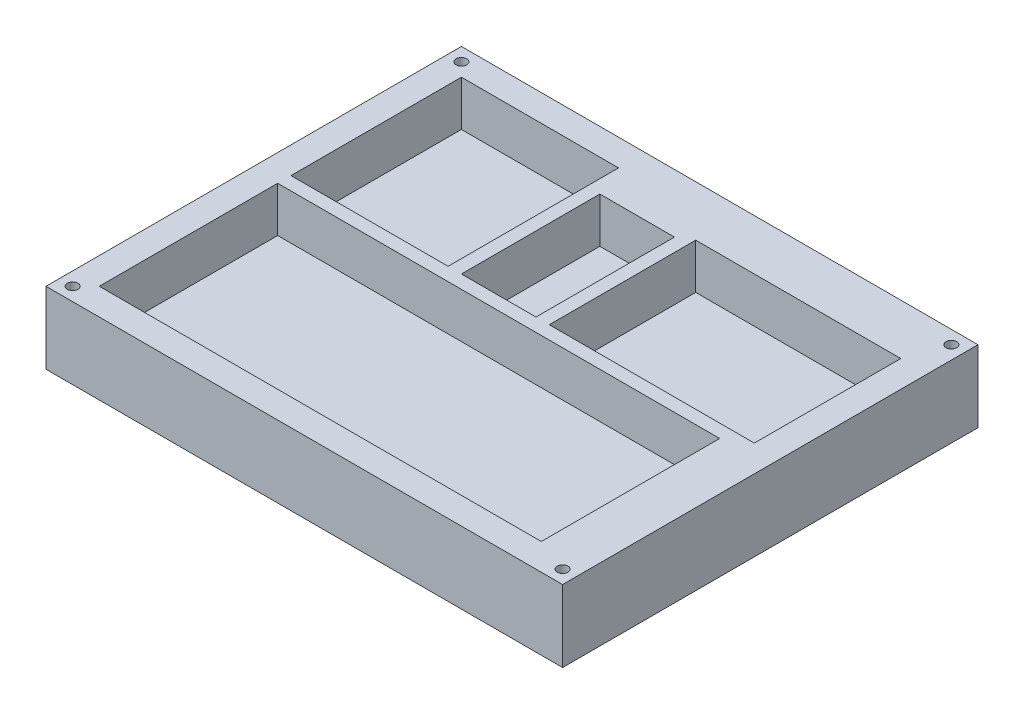
ISO-10303-21;
HEADER;
FILE_DESCRIPTION(('STEP AP214'),'2;1');
FILE_NAME('part.step','',(''),(''),'','','');
FILE_SCHEMA(('AUTOMOTIVE_DESIGN { 1 0 10303 214 1 1 1 1 }'));
ENDSEC;
DATA;
#1=APPLICATION_CONTEXT('core data for automotive mechanical design processes');
#2=APPLICATION_PROTOCOL_DEFINITION('international standard','automotive_design',2000,#1);
#3=PRODUCT_CONTEXT('',#1,'mechanical');
#4=PRODUCT('Part','Part','',(#3));
#5=PRODUCT_RELATED_PRODUCT_CATEGORY('part','',(#4));
#6=PRODUCT_DEFINITION_FORMATION('','',#4);
#7=PRODUCT_DEFINITION_CONTEXT('part definition',#1,'design');
#8=PRODUCT_DEFINITION('design','',#6,#7);
#9=PRODUCT_DEFINITION_SHAPE('','',#8);
#10=(LENGTH_UNIT() NAMED_UNIT(*) SI_UNIT(.MILLI.,.METRE.));
#11=(NAMED_UNIT(*) PLANE_ANGLE_UNIT() SI_UNIT($,.RADIAN.));
#12=(NAMED_UNIT(*) SI_UNIT($,.STERADIAN.) SOLID_ANGLE_UNIT());
#13=UNCERTAINTY_MEASURE_WITH_UNIT(LENGTH_MEASURE(1.E-05),#10,'distance_accuracy_value','');
#14=(GEOMETRIC_REPRESENTATION_CONTEXT(3) GLOBAL_UNCERTAINTY_ASSIGNED_CONTEXT((#13)) GLOBAL_UNIT_ASSIGNED_CONTEXT((#10,
#11,#12)) REPRESENTATION_CONTEXT('',''));
#15=CARTESIAN_POINT('',(0.,0.,0.));
#16=DIRECTION('',(0.,0.,1.));
#17=DIRECTION('',(1.,0.,0.));
#18=AXIS2_PLACEMENT_3D('',#15,#16,#17);
#19=CARTESIAN_POINT('',(0.,17.,-33.5));
#20=DIRECTION('',(0.,0.,-1.));
#21=DIRECTION('',(-1.,0.,0.));
#22=AXIS2_PLACEMENT_3D('',#19,#20,#21);
#23=PLANE('',#22);
#24=DIRECTION('',(1.,0.,0.));
#25=VECTOR('',#24,1.);
#26=CARTESIAN_POINT('',(0.,0.,-33.5));
#27=LINE('',#26,#25);
#28=CARTESIAN_POINT('',(-83.,0.,-33.5));
#29=VERTEX_POINT('',#28);
#30=CARTESIAN_POINT('',(83.,0.,-33.5));
#31=VERTEX_POINT('',#30);
#32=EDGE_CURVE('E227',#29,#31,#27,.T.);
#33=ORIENTED_EDGE('',*,*,#32,.T.);
#34=DIRECTION('',(0.,-1.,0.));
#35=VECTOR('',#34,1.);
#36=CARTESIAN_POINT('',(83.,17.,-33.5));
#37=LINE('',#36,#35);
#38=CARTESIAN_POINT('',(83.,17.,-33.5));
#39=VERTEX_POINT('',#38);
#40=EDGE_CURVE('E11',#39,#31,#37,.T.);
#41=ORIENTED_EDGE('',*,*,#40,.F.);
#42=DIRECTION('',(1.,0.,0.));
#43=VECTOR('',#42,1.);
#44=CARTESIAN_POINT('',(0.,17.,-33.5));
#45=LINE('',#44,#43);
#46=CARTESIAN_POINT('',(-83.,17.,-33.5));
#47=VERTEX_POINT('',#46);
#48=EDGE_CURVE('E173',#47,#39,#45,.T.);
#49=ORIENTED_EDGE('',*,*,#48,.F.);
#50=DIRECTION('',(0.,-1.,0.));
#51=VECTOR('',#50,1.);
#52=CARTESIAN_POINT('',(-83.,17.,-33.5));
#53=LINE('',#52,#51);
#54=EDGE_CURVE('E59',#47,#29,#53,.T.);
#55=ORIENTED_EDGE('',*,*,#54,.T.);
#56=EDGE_LOOP('',(#33,#41,#49,#55));
#57=FACE_BOUND('',#56,.T.);
#58=ADVANCED_FACE('F40',(#57),#23,.F.);
#59=CARTESIAN_POINT('',(83.,17.,0.));
#60=DIRECTION('',(1.,0.,0.));
#61=DIRECTION('',(0.,0.,-1.));
#62=AXIS2_PLACEMENT_3D('',#59,#60,#61);
#63=PLANE('',#62);
#64=DIRECTION('',(0.,0.,1.));
#65=VECTOR('',#64,1.);
#66=CARTESIAN_POINT('',(83.,0.,0.));
#67=LINE('',#66,#65);
#68=CARTESIAN_POINT('',(83.,0.,33.5));
#69=VERTEX_POINT('',#68);
#70=EDGE_CURVE('E179',#31,#69,#67,.T.);
#71=ORIENTED_EDGE('',*,*,#70,.T.);
#72=DIRECTION('',(0.,-1.,0.));
#73=VECTOR('',#72,1.);
#74=CARTESIAN_POINT('',(83.,17.,33.5));
#75=LINE('',#74,#73);
#76=CARTESIAN_POINT('',(83.,17.,33.5));
#77=VERTEX_POINT('',#76);
#78=EDGE_CURVE('E50',#77,#69,#75,.T.);
#79=ORIENTED_EDGE('',*,*,#78,.F.);
#80=DIRECTION('',(0.,0.,1.));
#81=VECTOR('',#80,1.);
#82=CARTESIAN_POINT('',(83.,17.,0.));
#83=LINE('',#82,#81);
#84=EDGE_CURVE('E167',#39,#77,#83,.T.);
#85=ORIENTED_EDGE('',*,*,#84,.F.);
#86=ORIENTED_EDGE('',*,*,#40,.T.);
#87=EDGE_LOOP('',(#71,#79,#85,#86));
#88=FACE_BOUND('',#87,.T.);
#89=ADVANCED_FACE('F178',(#88),#63,.F.);
#90=CARTESIAN_POINT('',(0.,17.,33.5));
#91=DIRECTION('',(0.,0.,-1.));
#92=DIRECTION('',(-1.,0.,0.));
#93=AXIS2_PLACEMENT_3D('',#90,#91,#92);
#94=PLANE('',#93);
#95=DIRECTION('',(1.,0.,0.));
#96=VECTOR('',#95,1.);
#97=CARTESIAN_POINT('',(0.,0.,33.5));
#98=LINE('',#97,#96);
#99=CARTESIAN_POINT('',(-83.,0.,33.5));
#100=VERTEX_POINT('',#99);
#101=EDGE_CURVE('E104',#100,#69,#98,.T.);
#102=ORIENTED_EDGE('',*,*,#101,.F.);
#103=DIRECTION('',(0.,-1.,0.));
#104=VECTOR('',#103,1.);
#105=CARTESIAN_POINT('',(-83.,17.,33.5));
#106=LINE('',#105,#104);
#107=CARTESIAN_POINT('',(-83.,17.,33.5));
#108=VERTEX_POINT('',#107);
#109=EDGE_CURVE('E181',#108,#100,#106,.T.);
#110=ORIENTED_EDGE('',*,*,#109,.F.);
#111=DIRECTION('',(1.,0.,0.));
#112=VECTOR('',#111,1.);
#113=CARTESIAN_POINT('',(0.,17.,33.5));
#114=LINE('',#113,#112);
#115=EDGE_CURVE('E172',#108,#77,#114,.T.);
#116=ORIENTED_EDGE('',*,*,#115,.T.);
#117=ORIENTED_EDGE('',*,*,#78,.T.);
#118=EDGE_LOOP('',(#102,#110,#116,#117));
#119=FACE_BOUND('',#118,.T.);
#120=ADVANCED_FACE('F183',(#119),#94,.T.);
#121=CARTESIAN_POINT('',(-24.,17.,0.));
#122=DIRECTION('',(-1.,0.,0.));
#123=DIRECTION('',(0.,0.,1.));
#124=AXIS2_PLACEMENT_3D('',#121,#122,#123);
#125=PLANE('',#124);
#126=DIRECTION('',(0.,0.,-1.));
#127=VECTOR('',#126,1.);
#128=CARTESIAN_POINT('',(-24.,0.,0.));
#129=LINE('',#128,#127);
#130=CARTESIAN_POINT('',(-24.,0.,-38.5));
#131=VERTEX_POINT('',#130);
#132=CARTESIAN_POINT('',(-24.,0.,-102.5));
#133=VERTEX_POINT('',#132);
#134=EDGE_CURVE('E216',#131,#133,#129,.T.);
#135=ORIENTED_EDGE('',*,*,#134,.F.);
#136=DIRECTION('',(0.,-1.,0.));
#137=VECTOR('',#136,1.);
#138=CARTESIAN_POINT('',(-24.,17.,-38.5));
#139=LINE('',#138,#137);
#140=CARTESIAN_POINT('',(-24.,17.,-38.5));
#141=VERTEX_POINT('',#140);
#142=EDGE_CURVE('E236',#141,#131,#139,.T.);
#143=ORIENTED_EDGE('',*,*,#142,.F.);
#144=DIRECTION('',(0.,0.,-1.));
#145=VECTOR('',#144,1.);
#146=CARTESIAN_POINT('',(-24.,17.,0.));
#147=LINE('',#146,#145);
#148=CARTESIAN_POINT('',(-24.,17.,-102.5));
#149=VERTEX_POINT('',#148);
#150=EDGE_CURVE('E326',#141,#149,#147,.T.);
#151=ORIENTED_EDGE('',*,*,#150,.T.);
#152=DIRECTION('',(0.,-1.,0.));
#153=VECTOR('',#152,1.);
#154=CARTESIAN_POINT('',(-24.,17.,-102.5));
#155=LINE('',#154,#153);
#156=EDGE_CURVE('E96',#149,#133,#155,.T.);
#157=ORIENTED_EDGE('',*,*,#156,.T.);
#158=EDGE_LOOP('',(#135,#143,#151,#157));
#159=FACE_BOUND('',#158,.T.);
#160=ADVANCED_FACE('F343',(#159),#125,.T.);
#161=CARTESIAN_POINT('',(0.,17.,-38.5));
#162=DIRECTION('',(0.,0.,-1.));
#163=DIRECTION('',(-1.,0.,0.));
#164=AXIS2_PLACEMENT_3D('',#161,#162,#163);
#165=PLANE('',#164);
#166=DIRECTION('',(1.,0.,0.));
#167=VECTOR('',#166,1.);
#168=CARTESIAN_POINT('',(0.,0.,-38.5));
#169=LINE('',#168,#167);
#170=CARTESIAN_POINT('',(-83.,0.,-38.5));
#171=VERTEX_POINT('',#170);
#172=EDGE_CURVE('E219',#171,#131,#169,.T.);
#173=ORIENTED_EDGE('',*,*,#172,.F.);
#174=DIRECTION('',(0.,-1.,0.));
#175=VECTOR('',#174,1.);
#176=CARTESIAN_POINT('',(-83.,17.,-38.5));
#177=LINE('',#176,#175);
#178=CARTESIAN_POINT('',(-83.,17.,-38.5));
#179=VERTEX_POINT('',#178);
#180=EDGE_CURVE('E242',#179,#171,#177,.T.);
#181=ORIENTED_EDGE('',*,*,#180,.F.);
#182=DIRECTION('',(1.,0.,0.));
#183=VECTOR('',#182,1.);
#184=CARTESIAN_POINT('',(0.,17.,-38.5));
#185=LINE('',#184,#183);
#186=EDGE_CURVE('E328',#179,#141,#185,.T.);
#187=ORIENTED_EDGE('',*,*,#186,.T.);
#188=ORIENTED_EDGE('',*,*,#142,.T.);
#189=EDGE_LOOP('',(#173,#181,#187,#188));
#190=FACE_BOUND('',#189,.T.);
#191=ADVANCED_FACE('F347',(#190),#165,.T.);
#192=CARTESIAN_POINT('',(-83.,17.,0.));
#193=DIRECTION('',(-1.,0.,0.));
#194=DIRECTION('',(0.,0.,1.));
#195=AXIS2_PLACEMENT_3D('',#192,#193,#194);
#196=PLANE('',#195);
#197=DIRECTION('',(0.,0.,-1.));
#198=VECTOR('',#197,1.);
#199=CARTESIAN_POINT('',(-83.,0.,0.));
#200=LINE('',#199,#198);
#201=CARTESIAN_POINT('',(-83.,0.,-102.5));
#202=VERTEX_POINT('',#201);
#203=EDGE_CURVE('E222',#171,#202,#200,.T.);
#204=ORIENTED_EDGE('',*,*,#203,.T.);
#205=DIRECTION('',(0.,-1.,0.));
#206=VECTOR('',#205,1.);
#207=CARTESIAN_POINT('',(-83.,17.,-102.5));
#208=LINE('',#207,#206);
#209=CARTESIAN_POINT('',(-83.,17.,-102.5));
#210=VERTEX_POINT('',#209);
#211=EDGE_CURVE('E239',#210,#202,#208,.T.);
#212=ORIENTED_EDGE('',*,*,#211,.F.);
#213=DIRECTION('',(0.,0.,-1.));
#214=VECTOR('',#213,1.);
#215=CARTESIAN_POINT('',(-83.,17.,0.));
#216=LINE('',#215,#214);
#217=EDGE_CURVE('E331',#179,#210,#216,.T.);
#218=ORIENTED_EDGE('',*,*,#217,.F.);
#219=ORIENTED_EDGE('',*,*,#180,.T.);
#220=EDGE_LOOP('',(#204,#212,#218,#219));
#221=FACE_BOUND('',#220,.T.);
#222=ADVANCED_FACE('F355',(#221),#196,.F.);
#223=CARTESIAN_POINT('',(9.00000000000002,17.,0.));
#224=DIRECTION('',(-1.,0.,0.));
#225=DIRECTION('',(0.,0.,1.));
#226=AXIS2_PLACEMENT_3D('',#223,#224,#225);
#227=PLANE('',#226);
#228=DIRECTION('',(0.,0.,-1.));
#229=VECTOR('',#228,1.);
#230=CARTESIAN_POINT('',(9.00000000000002,0.,0.));
#231=LINE('',#230,#229);
#232=CARTESIAN_POINT('',(9.00000000000002,0.,-38.5));
#233=VERTEX_POINT('',#232);
#234=CARTESIAN_POINT('',(9.00000000000002,0.,-90.5));
#235=VERTEX_POINT('',#234);
#236=EDGE_CURVE('E204',#233,#235,#231,.T.);
#237=ORIENTED_EDGE('',*,*,#236,.F.);
#238=DIRECTION('',(0.,-1.,0.));
#239=VECTOR('',#238,1.);
#240=CARTESIAN_POINT('',(9.00000000000002,17.,-38.5));
#241=LINE('',#240,#239);
#242=CARTESIAN_POINT('',(9.00000000000002,17.,-38.5));
#243=VERTEX_POINT('',#242);
#244=EDGE_CURVE('E240',#243,#233,#241,.T.);
#245=ORIENTED_EDGE('',*,*,#244,.F.);
#246=DIRECTION('',(0.,0.,-1.));
#247=VECTOR('',#246,1.);
#248=CARTESIAN_POINT('',(9.00000000000002,17.,0.));
#249=LINE('',#248,#247);
#250=CARTESIAN_POINT('',(9.00000000000002,17.,-90.5));
#251=VERTEX_POINT('',#250);
#252=EDGE_CURVE('E315',#243,#251,#249,.T.);
#253=ORIENTED_EDGE('',*,*,#252,.T.);
#254=DIRECTION('',(0.,-1.,0.));
#255=VECTOR('',#254,1.);
#256=CARTESIAN_POINT('',(9.00000000000002,17.,-90.5));
#257=LINE('',#256,#255);
#258=EDGE_CURVE('E246',#251,#235,#257,.T.);
#259=ORIENTED_EDGE('',*,*,#258,.T.);
#260=EDGE_LOOP('',(#237,#245,#253,#259));
#261=FACE_BOUND('',#260,.T.);
#262=ADVANCED_FACE('F357',(#261),#227,.T.);
#263=CARTESIAN_POINT('',(0.,17.,-38.5));
#264=DIRECTION('',(0.,0.,-1.));
#265=DIRECTION('',(-1.,0.,0.));
#266=AXIS2_PLACEMENT_3D('',#263,#264,#265);
#267=PLANE('',#266);
#268=DIRECTION('',(1.,0.,0.));
#269=VECTOR('',#268,1.);
#270=CARTESIAN_POINT('',(0.,0.,-38.5));
#271=LINE('',#270,#269);
#272=CARTESIAN_POINT('',(-19.,0.,-38.5));
#273=VERTEX_POINT('',#272);
#274=EDGE_CURVE('E207',#273,#233,#271,.T.);
#275=ORIENTED_EDGE('',*,*,#274,.F.);
#276=DIRECTION('',(0.,-1.,0.));
#277=VECTOR('',#276,1.);
#278=CARTESIAN_POINT('',(-19.,17.,-38.5));
#279=LINE('',#278,#277);
#280=CARTESIAN_POINT('',(-19.,17.,-38.5));
#281=VERTEX_POINT('',#280);
#282=EDGE_CURVE('E251',#281,#273,#279,.T.);
#283=ORIENTED_EDGE('',*,*,#282,.F.);
#284=DIRECTION('',(1.,0.,0.));
#285=VECTOR('',#284,1.);
#286=CARTESIAN_POINT('',(0.,17.,-38.5));
#287=LINE('',#286,#285);
#288=EDGE_CURVE('E318',#281,#243,#287,.T.);
#289=ORIENTED_EDGE('',*,*,#288,.T.);
#290=ORIENTED_EDGE('',*,*,#244,.T.);
#291=EDGE_LOOP('',(#275,#283,#289,#290));
#292=FACE_BOUND('',#291,.T.);
#293=ADVANCED_FACE('F363',(#292),#267,.T.);
#294=CARTESIAN_POINT('',(-19.,17.,0.));
#295=DIRECTION('',(-1.,0.,0.));
#296=DIRECTION('',(0.,0.,1.));
#297=AXIS2_PLACEMENT_3D('',#294,#295,#296);
#298=PLANE('',#297);
#299=DIRECTION('',(0.,0.,-1.));
#300=VECTOR('',#299,1.);
#301=CARTESIAN_POINT('',(-19.,0.,0.));
#302=LINE('',#301,#300);
#303=CARTESIAN_POINT('',(-19.,0.,-90.5));
#304=VERTEX_POINT('',#303);
#305=EDGE_CURVE('E210',#273,#304,#302,.T.);
#306=ORIENTED_EDGE('',*,*,#305,.T.);
#307=DIRECTION('',(0.,-1.,0.));
#308=VECTOR('',#307,1.);
#309=CARTESIAN_POINT('',(-19.,17.,-90.5));
#310=LINE('',#309,#308);
#311=CARTESIAN_POINT('',(-19.,17.,-90.5));
#312=VERTEX_POINT('',#311);
#313=EDGE_CURVE('E248',#312,#304,#310,.T.);
#314=ORIENTED_EDGE('',*,*,#313,.F.);
#315=DIRECTION('',(0.,0.,-1.));
#316=VECTOR('',#315,1.);
#317=CARTESIAN_POINT('',(-19.,17.,0.));
#318=LINE('',#317,#316);
#319=EDGE_CURVE('E321',#281,#312,#318,.T.);
#320=ORIENTED_EDGE('',*,*,#319,.F.);
#321=ORIENTED_EDGE('',*,*,#282,.T.);
#322=EDGE_LOOP('',(#306,#314,#320,#321));
#323=FACE_BOUND('',#322,.T.);
#324=ADVANCED_FACE('F400',(#323),#298,.F.);
#325=CARTESIAN_POINT('',(91.,17.,0.));
#326=DIRECTION('',(-1.,0.,0.));
#327=DIRECTION('',(0.,0.,1.));
#328=AXIS2_PLACEMENT_3D('',#325,#326,#327);
#329=PLANE('',#328);
#330=DIRECTION('',(0.,0.,-1.));
#331=VECTOR('',#330,1.);
#332=CARTESIAN_POINT('',(91.,0.,0.));
#333=LINE('',#332,#331);
#334=CARTESIAN_POINT('',(91.,0.,-38.5));
#335=VERTEX_POINT('',#334);
#336=CARTESIAN_POINT('',(91.,0.,-93.5));
#337=VERTEX_POINT('',#336);
#338=EDGE_CURVE('E191',#335,#337,#333,.T.);
#339=ORIENTED_EDGE('',*,*,#338,.F.);
#340=DIRECTION('',(0.,-1.,0.));
#341=VECTOR('',#340,1.);
#342=CARTESIAN_POINT('',(91.,17.,-38.5));
#343=LINE('',#342,#341);
#344=CARTESIAN_POINT('',(91.,17.,-38.5));
#345=VERTEX_POINT('',#344);
#346=EDGE_CURVE('E249',#345,#335,#343,.T.);
#347=ORIENTED_EDGE('',*,*,#346,.F.);
#348=DIRECTION('',(0.,0.,-1.));
#349=VECTOR('',#348,1.);
#350=CARTESIAN_POINT('',(91.,17.,0.));
#351=LINE('',#350,#349);
#352=CARTESIAN_POINT('',(91.,17.,-93.5));
#353=VERTEX_POINT('',#352);
#354=EDGE_CURVE('E304',#345,#353,#351,.T.);
#355=ORIENTED_EDGE('',*,*,#354,.T.);
#356=DIRECTION('',(0.,-1.,0.));
#357=VECTOR('',#356,1.);
#358=CARTESIAN_POINT('',(91.,17.,-93.5));
#359=LINE('',#358,#357);
#360=EDGE_CURVE('E255',#353,#337,#359,.T.);
#361=ORIENTED_EDGE('',*,*,#360,.T.);
#362=EDGE_LOOP('',(#339,#347,#355,#361));
#363=FACE_BOUND('',#362,.T.);
#364=ADVANCED_FACE('F396',(#363),#329,.T.);
#365=CARTESIAN_POINT('',(0.,17.,-38.5));
#366=DIRECTION('',(0.,0.,-1.));
#367=DIRECTION('',(-1.,0.,0.));
#368=AXIS2_PLACEMENT_3D('',#365,#366,#367);
#369=PLANE('',#368);
#370=DIRECTION('',(1.,0.,0.));
#371=VECTOR('',#370,1.);
#372=CARTESIAN_POINT('',(0.,0.,-38.5));
#373=LINE('',#372,#371);
#374=CARTESIAN_POINT('',(14.,0.,-38.5));
#375=VERTEX_POINT('',#374);
#376=EDGE_CURVE('E194',#375,#335,#373,.T.);
#377=ORIENTED_EDGE('',*,*,#376,.F.);
#378=DIRECTION('',(0.,-1.,0.));
#379=VECTOR('',#378,1.);
#380=CARTESIAN_POINT('',(14.,17.,-38.5));
#381=LINE('',#380,#379);
#382=CARTESIAN_POINT('',(14.,17.,-38.5));
#383=VERTEX_POINT('',#382);
#384=EDGE_CURVE('E259',#383,#375,#381,.T.);
#385=ORIENTED_EDGE('',*,*,#384,.F.);
#386=DIRECTION('',(1.,0.,0.));
#387=VECTOR('',#386,1.);
#388=CARTESIAN_POINT('',(0.,17.,-38.5));
#389=LINE('',#388,#387);
#390=EDGE_CURVE('E307',#383,#345,#389,.T.);
#391=ORIENTED_EDGE('',*,*,#390,.T.);
#392=ORIENTED_EDGE('',*,*,#346,.T.);
#393=EDGE_LOOP('',(#377,#385,#391,#392));
#394=FACE_BOUND('',#393,.T.);
#395=ADVANCED_FACE('F399',(#394),#369,.T.);
#396=CARTESIAN_POINT('',(14.,17.,0.));
#397=DIRECTION('',(-1.,0.,0.));
#398=DIRECTION('',(0.,0.,1.));
#399=AXIS2_PLACEMENT_3D('',#396,#397,#398);
#400=PLANE('',#399);
#401=DIRECTION('',(0.,0.,-1.));
#402=VECTOR('',#401,1.);
#403=CARTESIAN_POINT('',(14.,0.,0.));
#404=LINE('',#403,#402);
#405=CARTESIAN_POINT('',(14.,0.,-93.5));
#406=VERTEX_POINT('',#405);
#407=EDGE_CURVE('E198',#375,#406,#404,.T.);
#408=ORIENTED_EDGE('',*,*,#407,.T.);
#409=DIRECTION('',(0.,-1.,0.));
#410=VECTOR('',#409,1.);
#411=CARTESIAN_POINT('',(14.,17.,-93.5));
#412=LINE('',#411,#410);
#413=CARTESIAN_POINT('',(14.,17.,-93.5));
#414=VERTEX_POINT('',#413);
#415=EDGE_CURVE('E257',#414,#406,#412,.T.);
#416=ORIENTED_EDGE('',*,*,#415,.F.);
#417=DIRECTION('',(0.,0.,-1.));
#418=VECTOR('',#417,1.);
#419=CARTESIAN_POINT('',(14.,17.,0.));
#420=LINE('',#419,#418);
#421=EDGE_CURVE('E310',#383,#414,#420,.T.);
#422=ORIENTED_EDGE('',*,*,#421,.F.);
#423=ORIENTED_EDGE('',*,*,#384,.T.);
#424=EDGE_LOOP('',(#408,#416,#422,#423));
#425=FACE_BOUND('',#424,.T.);
#426=ADVANCED_FACE('F404',(#425),#400,.F.);
#427=CARTESIAN_POINT('',(101.,17.,0.));
#428=DIRECTION('',(1.,0.,0.));
#429=DIRECTION('',(0.,0.,-1.));
#430=AXIS2_PLACEMENT_3D('',#427,#428,#429);
#431=PLANE('',#430);
#432=DIRECTION('',(0.,-1.,0.));
#433=VECTOR('',#432,1.);
#434=CARTESIAN_POINT('',(101.,17.,43.5));
#435=LINE('',#434,#433);
#436=CARTESIAN_POINT('',(101.,17.,43.5));
#437=VERTEX_POINT('',#436);
#438=CARTESIAN_POINT('',(101.,-10.,43.5));
#439=VERTEX_POINT('',#438);
#440=EDGE_CURVE('E187',#437,#439,#435,.T.);
#441=ORIENTED_EDGE('',*,*,#440,.T.);
#442=DIRECTION('',(0.,0.,1.));
#443=VECTOR('',#442,1.);
#444=CARTESIAN_POINT('',(101.,-10.,43.5));
#445=LINE('',#444,#443);
#446=CARTESIAN_POINT('',(101.,-10.,-112.5));
#447=VERTEX_POINT('',#446);
#448=EDGE_CURVE('E289',#447,#439,#445,.T.);
#449=ORIENTED_EDGE('',*,*,#448,.F.);
#450=DIRECTION('',(0.,-1.,0.));
#451=VECTOR('',#450,1.);
#452=CARTESIAN_POINT('',(101.,17.,-112.5));
#453=LINE('',#452,#451);
#454=CARTESIAN_POINT('',(101.,17.,-112.5));
#455=VERTEX_POINT('',#454);
#456=EDGE_CURVE('E44',#455,#447,#453,.T.);
#457=ORIENTED_EDGE('',*,*,#456,.F.);
#458=DIRECTION('',(0.,0.,1.));
#459=VECTOR('',#458,1.);
#460=CARTESIAN_POINT('',(101.,17.,0.));
#461=LINE('',#460,#459);
#462=EDGE_CURVE('E234',#455,#437,#461,.T.);
#463=ORIENTED_EDGE('',*,*,#462,.T.);
#464=EDGE_LOOP('',(#441,#449,#457,#463));
#465=FACE_BOUND('',#464,.T.);
#466=ADVANCED_FACE('F42',(#465),#431,.T.);
#467=CARTESIAN_POINT('',(0.,17.,-112.5));
#468=DIRECTION('',(0.,0.,-1.));
#469=DIRECTION('',(-1.,0.,0.));
#470=AXIS2_PLACEMENT_3D('',#467,#468,#469);
#471=PLANE('',#470);
#472=ORIENTED_EDGE('',*,*,#456,.T.);
#473=DIRECTION('',(1.,0.,0.));
#474=VECTOR('',#473,1.);
#475=CARTESIAN_POINT('',(-93.,-10.,-112.5));
#476=LINE('',#475,#474);
#477=CARTESIAN_POINT('',(-93.,-10.,-112.5));
#478=VERTEX_POINT('',#477);
#479=EDGE_CURVE('E279',#478,#447,#476,.T.);
#480=ORIENTED_EDGE('',*,*,#479,.F.);
#481=DIRECTION('',(0.,-1.,0.));
#482=VECTOR('',#481,1.);
#483=CARTESIAN_POINT('',(-93.,17.,-112.5));
#484=LINE('',#483,#482);
#485=CARTESIAN_POINT('',(-93.,17.,-112.5));
#486=VERTEX_POINT('',#485);
#487=EDGE_CURVE('E267',#486,#478,#484,.T.);
#488=ORIENTED_EDGE('',*,*,#487,.F.);
#489=DIRECTION('',(1.,0.,0.));
#490=VECTOR('',#489,1.);
#491=CARTESIAN_POINT('',(0.,17.,-112.5));
#492=LINE('',#491,#490);
#493=EDGE_CURVE('E282',#486,#455,#492,.T.);
#494=ORIENTED_EDGE('',*,*,#493,.T.);
#495=EDGE_LOOP('',(#472,#480,#488,#494));
#496=FACE_BOUND('',#495,.T.);
#497=ADVANCED_FACE('F278',(#496),#471,.T.);
#498=CARTESIAN_POINT('',(-93.,17.,0.));
#499=DIRECTION('',(-1.,0.,0.));
#500=DIRECTION('',(0.,0.,1.));
#501=AXIS2_PLACEMENT_3D('',#498,#499,#500);
#502=PLANE('',#501);
#503=ORIENTED_EDGE('',*,*,#487,.T.);
#504=DIRECTION('',(0.,0.,-1.));
#505=VECTOR('',#504,1.);
#506=CARTESIAN_POINT('',(-93.,-10.,43.5));
#507=LINE('',#506,#505);
#508=CARTESIAN_POINT('',(-93.,-10.,43.5));
#509=VERTEX_POINT('',#508);
#510=EDGE_CURVE('E291',#509,#478,#507,.T.);
#511=ORIENTED_EDGE('',*,*,#510,.F.);
#512=DIRECTION('',(0.,-1.,0.));
#513=VECTOR('',#512,1.);
#514=CARTESIAN_POINT('',(-93.,17.,43.5));
#515=LINE('',#514,#513);
#516=CARTESIAN_POINT('',(-93.,17.,43.5));
#517=VERTEX_POINT('',#516);
#518=EDGE_CURVE('E265',#517,#509,#515,.T.);
#519=ORIENTED_EDGE('',*,*,#518,.F.);
#520=DIRECTION('',(0.,0.,-1.));
#521=VECTOR('',#520,1.);
#522=CARTESIAN_POINT('',(-93.,17.,0.));
#523=LINE('',#522,#521);
#524=EDGE_CURVE('E300',#517,#486,#523,.T.);
#525=ORIENTED_EDGE('',*,*,#524,.T.);
#526=EDGE_LOOP('',(#503,#511,#519,#525));
#527=FACE_BOUND('',#526,.T.);
#528=ADVANCED_FACE('F378',(#527),#502,.T.);
#529=CARTESIAN_POINT('',(0.,17.,-102.5));
#530=DIRECTION('',(0.,0.,-1.));
#531=DIRECTION('',(-1.,0.,0.));
#532=AXIS2_PLACEMENT_3D('',#529,#530,#531);
#533=PLANE('',#532);
#534=DIRECTION('',(1.,0.,0.));
#535=VECTOR('',#534,1.);
#536=CARTESIAN_POINT('',(0.,0.,-102.5));
#537=LINE('',#536,#535);
#538=EDGE_CURVE('E225',#202,#133,#537,.T.);
#539=ORIENTED_EDGE('',*,*,#538,.T.);
#540=ORIENTED_EDGE('',*,*,#156,.F.);
#541=DIRECTION('',(1.,0.,0.));
#542=VECTOR('',#541,1.);
#543=CARTESIAN_POINT('',(0.,17.,-102.5));
#544=LINE('',#543,#542);
#545=EDGE_CURVE('E334',#210,#149,#544,.T.);
#546=ORIENTED_EDGE('',*,*,#545,.F.);
#547=ORIENTED_EDGE('',*,*,#211,.T.);
#548=EDGE_LOOP('',(#539,#540,#546,#547));
#549=FACE_BOUND('',#548,.T.);
#550=ADVANCED_FACE('F341',(#549),#533,.F.);
#551=CARTESIAN_POINT('',(0.,17.,-90.5));
#552=DIRECTION('',(0.,0.,-1.));
#553=DIRECTION('',(-1.,0.,0.));
#554=AXIS2_PLACEMENT_3D('',#551,#552,#553);
#555=PLANE('',#554);
#556=DIRECTION('',(1.,0.,0.));
#557=VECTOR('',#556,1.);
#558=CARTESIAN_POINT('',(0.,0.,-90.5));
#559=LINE('',#558,#557);
#560=EDGE_CURVE('E213',#304,#235,#559,.T.);
#561=ORIENTED_EDGE('',*,*,#560,.T.);
#562=ORIENTED_EDGE('',*,*,#258,.F.);
#563=DIRECTION('',(1.,0.,0.));
#564=VECTOR('',#563,1.);
#565=CARTESIAN_POINT('',(0.,17.,-90.5));
#566=LINE('',#565,#564);
#567=EDGE_CURVE('E324',#312,#251,#566,.T.);
#568=ORIENTED_EDGE('',*,*,#567,.F.);
#569=ORIENTED_EDGE('',*,*,#313,.T.);
#570=EDGE_LOOP('',(#561,#562,#568,#569));
#571=FACE_BOUND('',#570,.T.);
#572=ADVANCED_FACE('F377',(#571),#555,.F.);
#573=CARTESIAN_POINT('',(0.,17.,-93.5));
#574=DIRECTION('',(0.,0.,-1.));
#575=DIRECTION('',(-1.,0.,0.));
#576=AXIS2_PLACEMENT_3D('',#573,#574,#575);
#577=PLANE('',#576);
#578=DIRECTION('',(1.,0.,0.));
#579=VECTOR('',#578,1.);
#580=CARTESIAN_POINT('',(0.,0.,-93.5));
#581=LINE('',#580,#579);
#582=EDGE_CURVE('E201',#406,#337,#581,.T.);
#583=ORIENTED_EDGE('',*,*,#582,.T.);
#584=ORIENTED_EDGE('',*,*,#360,.F.);
#585=DIRECTION('',(1.,0.,0.));
#586=VECTOR('',#585,1.);
#587=CARTESIAN_POINT('',(0.,17.,-93.5));
#588=LINE('',#587,#586);
#589=EDGE_CURVE('E313',#414,#353,#588,.T.);
#590=ORIENTED_EDGE('',*,*,#589,.F.);
#591=ORIENTED_EDGE('',*,*,#415,.T.);
#592=EDGE_LOOP('',(#583,#584,#590,#591));
#593=FACE_BOUND('',#592,.T.);
#594=ADVANCED_FACE('F383',(#593),#577,.F.);
#595=CARTESIAN_POINT('',(0.,17.,43.5));
#596=DIRECTION('',(0.,0.,-1.));
#597=DIRECTION('',(-1.,0.,0.));
#598=AXIS2_PLACEMENT_3D('',#595,#596,#597);
#599=PLANE('',#598);
#600=ORIENTED_EDGE('',*,*,#518,.T.);
#601=DIRECTION('',(-1.,0.,0.));
#602=VECTOR('',#601,1.);
#603=CARTESIAN_POINT('',(-93.,-10.,43.5));
#604=LINE('',#603,#602);
#605=EDGE_CURVE('E195',#439,#509,#604,.T.);
#606=ORIENTED_EDGE('',*,*,#605,.F.);
#607=ORIENTED_EDGE('',*,*,#440,.F.);
#608=DIRECTION('',(1.,0.,0.));
#609=VECTOR('',#608,1.);
#610=CARTESIAN_POINT('',(0.,17.,43.5));
#611=LINE('',#610,#609);
#612=EDGE_CURVE('E302',#517,#437,#611,.T.);
#613=ORIENTED_EDGE('',*,*,#612,.F.);
#614=EDGE_LOOP('',(#600,#606,#607,#613));
#615=FACE_BOUND('',#614,.T.);
#616=ADVANCED_FACE('F391',(#615),#599,.F.);
#617=CARTESIAN_POINT('',(-83.,17.,0.));
#618=DIRECTION('',(1.,0.,0.));
#619=DIRECTION('',(0.,0.,-1.));
#620=AXIS2_PLACEMENT_3D('',#617,#618,#619);
#621=PLANE('',#620);
#622=DIRECTION('',(0.,0.,1.));
#623=VECTOR('',#622,1.);
#624=CARTESIAN_POINT('',(-83.,0.,0.));
#625=LINE('',#624,#623);
#626=EDGE_CURVE('E232',#29,#100,#625,.T.);
#627=ORIENTED_EDGE('',*,*,#626,.F.);
#628=ORIENTED_EDGE('',*,*,#54,.F.);
#629=DIRECTION('',(0.,0.,1.));
#630=VECTOR('',#629,1.);
#631=CARTESIAN_POINT('',(-83.,17.,0.));
#632=LINE('',#631,#630);
#633=EDGE_CURVE('E185',#47,#108,#632,.T.);
#634=ORIENTED_EDGE('',*,*,#633,.T.);
#635=ORIENTED_EDGE('',*,*,#109,.T.);
#636=EDGE_LOOP('',(#627,#628,#634,#635));
#637=FACE_BOUND('',#636,.T.);
#638=ADVANCED_FACE('F394',(#637),#621,.T.);
#639=CARTESIAN_POINT('',(0.,17.,0.));
#640=DIRECTION('',(0.,1.,0.));
#641=DIRECTION('',(0.,0.,1.));
#642=AXIS2_PLACEMENT_3D('',#639,#640,#641);
#643=PLANE('',#642);
#644=CARTESIAN_POINT('',(-88.,17.,-107.5));
#645=DIRECTION('',(0.,1.,0.));
#646=DIRECTION('',(0.,0.,1.));
#647=AXIS2_PLACEMENT_3D('',#644,#645,#646);
#648=CIRCLE('',#647,2.);
#649=CARTESIAN_POINT('',(-88.,17.,-105.5));
#650=VERTEX_POINT('',#649);
#651=EDGE_CURVE('E480',#650,#650,#648,.T.);
#652=ORIENTED_EDGE('',*,*,#651,.F.);
#653=EDGE_LOOP('',(#652));
#654=FACE_BOUND('',#653,.T.);
#655=CARTESIAN_POINT('',(96.,17.,38.5));
#656=DIRECTION('',(0.,1.,0.));
#657=DIRECTION('',(0.,0.,1.));
#658=AXIS2_PLACEMENT_3D('',#655,#656,#657);
#659=CIRCLE('',#658,2.);
#660=CARTESIAN_POINT('',(96.,17.,40.5));
#661=VERTEX_POINT('',#660);
#662=EDGE_CURVE('E477',#661,#661,#659,.T.);
#663=ORIENTED_EDGE('',*,*,#662,.F.);
#664=EDGE_LOOP('',(#663));
#665=FACE_BOUND('',#664,.T.);
#666=CARTESIAN_POINT('',(96.,17.,-107.5));
#667=DIRECTION('',(0.,1.,0.));
#668=DIRECTION('',(0.,0.,1.));
#669=AXIS2_PLACEMENT_3D('',#666,#667,#668);
#670=CIRCLE('',#669,2.);
#671=CARTESIAN_POINT('',(96.,17.,-105.5));
#672=VERTEX_POINT('',#671);
#673=EDGE_CURVE('E457',#672,#672,#670,.T.);
#674=ORIENTED_EDGE('',*,*,#673,.F.);
#675=EDGE_LOOP('',(#674));
#676=FACE_BOUND('',#675,.T.);
#677=CARTESIAN_POINT('',(-88.,17.,38.5));
#678=DIRECTION('',(0.,1.,0.));
#679=DIRECTION('',(0.,0.,1.));
#680=AXIS2_PLACEMENT_3D('',#677,#678,#679);
#681=CIRCLE('',#680,2.);
#682=CARTESIAN_POINT('',(-88.,17.,40.5));
#683=VERTEX_POINT('',#682);
#684=EDGE_CURVE('E473',#683,#683,#681,.T.);
#685=ORIENTED_EDGE('',*,*,#684,.F.);
#686=EDGE_LOOP('',(#685));
#687=FACE_BOUND('',#686,.T.);
#688=ORIENTED_EDGE('',*,*,#462,.F.);
#689=ORIENTED_EDGE('',*,*,#493,.F.);
#690=ORIENTED_EDGE('',*,*,#524,.F.);
#691=ORIENTED_EDGE('',*,*,#612,.T.);
#692=EDGE_LOOP('',(#688,#689,#690,#691));
#693=FACE_BOUND('',#692,.T.);
#694=ORIENTED_EDGE('',*,*,#354,.F.);
#695=ORIENTED_EDGE('',*,*,#390,.F.);
#696=ORIENTED_EDGE('',*,*,#421,.T.);
#697=ORIENTED_EDGE('',*,*,#589,.T.);
#698=EDGE_LOOP('',(#694,#695,#696,#697));
#699=FACE_BOUND('',#698,.T.);
#700=ORIENTED_EDGE('',*,*,#252,.F.);
#701=ORIENTED_EDGE('',*,*,#288,.F.);
#702=ORIENTED_EDGE('',*,*,#319,.T.);
#703=ORIENTED_EDGE('',*,*,#567,.T.);
#704=EDGE_LOOP('',(#700,#701,#702,#703));
#705=FACE_BOUND('',#704,.T.);
#706=ORIENTED_EDGE('',*,*,#150,.F.);
#707=ORIENTED_EDGE('',*,*,#186,.F.);
#708=ORIENTED_EDGE('',*,*,#217,.T.);
#709=ORIENTED_EDGE('',*,*,#545,.T.);
#710=EDGE_LOOP('',(#706,#707,#708,#709));
#711=FACE_BOUND('',#710,.T.);
#712=ORIENTED_EDGE('',*,*,#48,.T.);
#713=ORIENTED_EDGE('',*,*,#84,.T.);
#714=ORIENTED_EDGE('',*,*,#115,.F.);
#715=ORIENTED_EDGE('',*,*,#633,.F.);
#716=EDGE_LOOP('',(#712,#713,#714,#715));
#717=FACE_BOUND('',#716,.T.);
#718=ADVANCED_FACE('F169',(#654,#665,#676,#687,#693,#699,#705,#711,#717),#643,.T.);
#719=CARTESIAN_POINT('',(0.,0.,0.));
#720=DIRECTION('',(0.,-1.,0.));
#721=DIRECTION('',(0.,0.,-1.));
#722=AXIS2_PLACEMENT_3D('',#719,#720,#721);
#723=PLANE('',#722);
#724=ORIENTED_EDGE('',*,*,#32,.F.);
#725=ORIENTED_EDGE('',*,*,#626,.T.);
#726=ORIENTED_EDGE('',*,*,#101,.T.);
#727=ORIENTED_EDGE('',*,*,#70,.F.);
#728=EDGE_LOOP('',(#724,#725,#726,#727));
#729=FACE_BOUND('',#728,.T.);
#730=ADVANCED_FACE('F429',(#729),#723,.F.);
#731=ORIENTED_EDGE('',*,*,#172,.T.);
#732=ORIENTED_EDGE('',*,*,#134,.T.);
#733=ORIENTED_EDGE('',*,*,#538,.F.);
#734=ORIENTED_EDGE('',*,*,#203,.F.);
#735=EDGE_LOOP('',(#731,#732,#733,#734));
#736=FACE_BOUND('',#735,.T.);
#737=ADVANCED_FACE('F353',(#736),#723,.F.);
#738=ORIENTED_EDGE('',*,*,#274,.T.);
#739=ORIENTED_EDGE('',*,*,#236,.T.);
#740=ORIENTED_EDGE('',*,*,#560,.F.);
#741=ORIENTED_EDGE('',*,*,#305,.F.);
#742=EDGE_LOOP('',(#738,#739,#740,#741));
#743=FACE_BOUND('',#742,.T.);
#744=ADVANCED_FACE('F504',(#743),#723,.F.);
#745=ORIENTED_EDGE('',*,*,#376,.T.);
#746=ORIENTED_EDGE('',*,*,#338,.T.);
#747=ORIENTED_EDGE('',*,*,#582,.F.);
#748=ORIENTED_EDGE('',*,*,#407,.F.);
#749=EDGE_LOOP('',(#745,#746,#747,#748));
#750=FACE_BOUND('',#749,.T.);
#751=ADVANCED_FACE('F433',(#750),#723,.F.);
#752=CARTESIAN_POINT('',(0.,-10.,0.));
#753=DIRECTION('',(0.,-1.,0.));
#754=DIRECTION('',(0.,0.,-1.));
#755=AXIS2_PLACEMENT_3D('',#752,#753,#754);
#756=PLANE('',#755);
#757=CARTESIAN_POINT('',(-88.,-10.,-107.5));
#758=DIRECTION('',(0.,-1.,0.));
#759=DIRECTION('',(0.,0.,-1.));
#760=AXIS2_PLACEMENT_3D('',#757,#758,#759);
#761=CIRCLE('',#760,2.);
#762=CARTESIAN_POINT('',(-88.,-10.,-109.5));
#763=VERTEX_POINT('',#762);
#764=EDGE_CURVE('E465',#763,#763,#761,.T.);
#765=ORIENTED_EDGE('',*,*,#764,.F.);
#766=EDGE_LOOP('',(#765));
#767=FACE_BOUND('',#766,.T.);
#768=CARTESIAN_POINT('',(96.,-10.,38.5));
#769=DIRECTION('',(0.,-1.,0.));
#770=DIRECTION('',(0.,0.,-1.));
#771=AXIS2_PLACEMENT_3D('',#768,#769,#770);
#772=CIRCLE('',#771,2.);
#773=CARTESIAN_POINT('',(96.,-10.,36.5));
#774=VERTEX_POINT('',#773);
#775=EDGE_CURVE('E462',#774,#774,#772,.T.);
#776=ORIENTED_EDGE('',*,*,#775,.F.);
#777=EDGE_LOOP('',(#776));
#778=FACE_BOUND('',#777,.T.);
#779=CARTESIAN_POINT('',(96.,-10.,-107.5));
#780=DIRECTION('',(0.,-1.,0.));
#781=DIRECTION('',(0.,0.,-1.));
#782=AXIS2_PLACEMENT_3D('',#779,#780,#781);
#783=CIRCLE('',#782,2.);
#784=CARTESIAN_POINT('',(96.,-10.,-109.5));
#785=VERTEX_POINT('',#784);
#786=EDGE_CURVE('E460',#785,#785,#783,.T.);
#787=ORIENTED_EDGE('',*,*,#786,.F.);
#788=EDGE_LOOP('',(#787));
#789=FACE_BOUND('',#788,.T.);
#790=CARTESIAN_POINT('',(-88.,-10.,38.5));
#791=DIRECTION('',(0.,-1.,0.));
#792=DIRECTION('',(0.,0.,-1.));
#793=AXIS2_PLACEMENT_3D('',#790,#791,#792);
#794=CIRCLE('',#793,2.);
#795=CARTESIAN_POINT('',(-88.,-10.,36.5));
#796=VERTEX_POINT('',#795);
#797=EDGE_CURVE('E469',#796,#796,#794,.T.);
#798=ORIENTED_EDGE('',*,*,#797,.F.);
#799=EDGE_LOOP('',(#798));
#800=FACE_BOUND('',#799,.T.);
#801=ORIENTED_EDGE('',*,*,#510,.T.);
#802=ORIENTED_EDGE('',*,*,#479,.T.);
#803=ORIENTED_EDGE('',*,*,#448,.T.);
#804=ORIENTED_EDGE('',*,*,#605,.T.);
#805=EDGE_LOOP('',(#801,#802,#803,#804));
#806=FACE_BOUND('',#805,.T.);
#807=ADVANCED_FACE('F287',(#767,#778,#789,#800,#806),#756,.T.);
#808=CARTESIAN_POINT('',(-88.,20.,38.5));
#809=DIRECTION('',(0.,-1.,0.));
#810=DIRECTION('',(0.,0.,-1.));
#811=AXIS2_PLACEMENT_3D('',#808,#809,#810);
#812=CYLINDRICAL_SURFACE('',#811,2.);
#813=ORIENTED_EDGE('',*,*,#684,.T.);
#814=EDGE_LOOP('',(#813));
#815=FACE_BOUND('',#814,.T.);
#816=ORIENTED_EDGE('',*,*,#797,.T.);
#817=EDGE_LOOP('',(#816));
#818=FACE_BOUND('',#817,.T.);
#819=ADVANCED_FACE('F436',(#815,#818),#812,.F.);
#820=CARTESIAN_POINT('',(96.,20.,-107.5));
#821=DIRECTION('',(0.,-1.,0.));
#822=DIRECTION('',(0.,0.,-1.));
#823=AXIS2_PLACEMENT_3D('',#820,#821,#822);
#824=CYLINDRICAL_SURFACE('',#823,2.);
#825=ORIENTED_EDGE('',*,*,#673,.T.);
#826=EDGE_LOOP('',(#825));
#827=FACE_BOUND('',#826,.T.);
#828=ORIENTED_EDGE('',*,*,#786,.T.);
#829=EDGE_LOOP('',(#828));
#830=FACE_BOUND('',#829,.T.);
#831=ADVANCED_FACE('F440',(#827,#830),#824,.F.);
#832=CARTESIAN_POINT('',(96.,20.,38.5));
#833=DIRECTION('',(0.,-1.,0.));
#834=DIRECTION('',(0.,0.,-1.));
#835=AXIS2_PLACEMENT_3D('',#832,#833,#834);
#836=CYLINDRICAL_SURFACE('',#835,2.);
#837=ORIENTED_EDGE('',*,*,#662,.T.);
#838=EDGE_LOOP('',(#837));
#839=FACE_BOUND('',#838,.T.);
#840=ORIENTED_EDGE('',*,*,#775,.T.);
#841=EDGE_LOOP('',(#840));
#842=FACE_BOUND('',#841,.T.);
#843=ADVANCED_FACE('F442',(#839,#842),#836,.F.);
#844=CARTESIAN_POINT('',(-88.,20.,-107.5));
#845=DIRECTION('',(0.,-1.,0.));
#846=DIRECTION('',(0.,0.,-1.));
#847=AXIS2_PLACEMENT_3D('',#844,#845,#846);
#848=CYLINDRICAL_SURFACE('',#847,2.);
#849=ORIENTED_EDGE('',*,*,#651,.T.);
#850=EDGE_LOOP('',(#849));
#851=FACE_BOUND('',#850,.T.);
#852=ORIENTED_EDGE('',*,*,#764,.T.);
#853=EDGE_LOOP('',(#852));
#854=FACE_BOUND('',#853,.T.);
#855=ADVANCED_FACE('F445',(#851,#854),#848,.F.);
#856=CLOSED_SHELL('',(#58,#89,#120,#160,#191,#222,#262,#293,#324,#364,#395,#426,#466,#497,#528,
#550,#572,#594,#616,#638,#718,#730,#737,#744,#751,#807,#819,#831,#843,#855));
#857=MANIFOLD_SOLID_BREP('B2',#856);
#858=ADVANCED_BREP_SHAPE_REPRESENTATION('',(#18,#857),#14);
#859=SHAPE_DEFINITION_REPRESENTATION(#9,#858);
ENDSEC;
END-ISO-10303-21;
